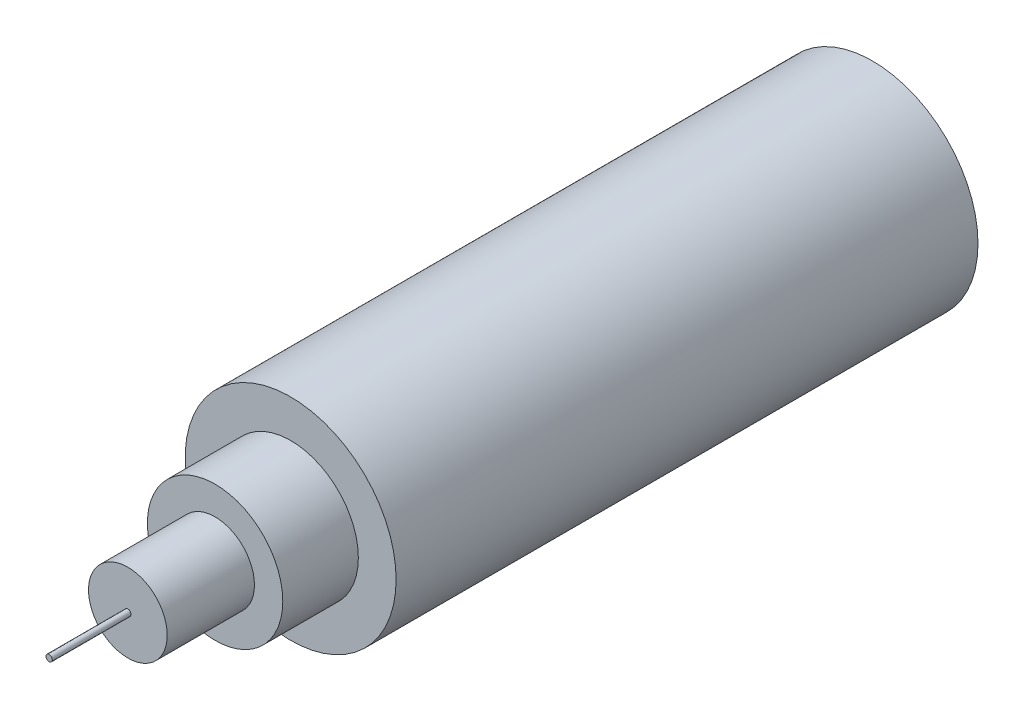
ISO-10303-21;
HEADER;
FILE_DESCRIPTION(('STEP AP214'),'2;1');
FILE_NAME('part.step','',(''),(''),'','','');
FILE_SCHEMA(('AUTOMOTIVE_DESIGN { 1 0 10303 214 1 1 1 1 }'));
ENDSEC;
DATA;
#1=APPLICATION_CONTEXT('core data for automotive mechanical design processes');
#2=APPLICATION_PROTOCOL_DEFINITION('international standard','automotive_design',2000,#1);
#3=PRODUCT_CONTEXT('',#1,'mechanical');
#4=PRODUCT('Part','Part','',(#3));
#5=PRODUCT_RELATED_PRODUCT_CATEGORY('part','',(#4));
#6=PRODUCT_DEFINITION_FORMATION('','',#4);
#7=PRODUCT_DEFINITION_CONTEXT('part definition',#1,'design');
#8=PRODUCT_DEFINITION('design','',#6,#7);
#9=PRODUCT_DEFINITION_SHAPE('','',#8);
#10=(LENGTH_UNIT() NAMED_UNIT(*) SI_UNIT(.MILLI.,.METRE.));
#11=(NAMED_UNIT(*) PLANE_ANGLE_UNIT() SI_UNIT($,.RADIAN.));
#12=(NAMED_UNIT(*) SI_UNIT($,.STERADIAN.) SOLID_ANGLE_UNIT());
#13=UNCERTAINTY_MEASURE_WITH_UNIT(LENGTH_MEASURE(1.E-05),#10,'distance_accuracy_value','');
#14=(GEOMETRIC_REPRESENTATION_CONTEXT(3) GLOBAL_UNCERTAINTY_ASSIGNED_CONTEXT((#13)) GLOBAL_UNIT_ASSIGNED_CONTEXT((#10,
#11,#12)) REPRESENTATION_CONTEXT('',''));
#15=CARTESIAN_POINT('',(0.,0.,0.));
#16=DIRECTION('',(0.,0.,1.));
#17=DIRECTION('',(1.,0.,0.));
#18=AXIS2_PLACEMENT_3D('',#15,#16,#17);
#19=CARTESIAN_POINT('',(0.,0.,236.5));
#20=DIRECTION('',(0.,0.,1.));
#21=DIRECTION('',(1.,0.,0.));
#22=AXIS2_PLACEMENT_3D('',#19,#20,#21);
#23=PLANE('',#22);
#24=CARTESIAN_POINT('',(0.,0.,236.5));
#25=DIRECTION('',(0.,0.,1.));
#26=DIRECTION('',(1.,0.,0.));
#27=AXIS2_PLACEMENT_3D('',#24,#25,#26);
#28=CIRCLE('',#27,12.5);
#29=CARTESIAN_POINT('',(12.5,0.,236.5));
#30=VERTEX_POINT('',#29);
#31=EDGE_CURVE('E47',#30,#30,#28,.T.);
#32=ORIENTED_EDGE('',*,*,#31,.T.);
#33=EDGE_LOOP('',(#32));
#34=FACE_BOUND('',#33,.T.);
#35=CARTESIAN_POINT('',(0.,0.,236.5));
#36=DIRECTION('',(0.,0.,1.));
#37=DIRECTION('',(1.,0.,0.));
#38=AXIS2_PLACEMENT_3D('',#35,#36,#37);
#39=CIRCLE('',#38,1.);
#40=CARTESIAN_POINT('',(1.,0.,236.5));
#41=VERTEX_POINT('',#40);
#42=EDGE_CURVE('E56',#41,#41,#39,.T.);
#43=ORIENTED_EDGE('',*,*,#42,.F.);
#44=EDGE_LOOP('',(#43));
#45=FACE_BOUND('',#44,.T.);
#46=ADVANCED_FACE('F31',(#34,#45),#23,.T.);
#47=CARTESIAN_POINT('',(0.,0.,208.8));
#48=DIRECTION('',(0.,0.,1.));
#49=DIRECTION('',(1.,0.,0.));
#50=AXIS2_PLACEMENT_3D('',#47,#48,#49);
#51=PLANE('',#50);
#52=CARTESIAN_POINT('',(0.,0.,208.8));
#53=DIRECTION('',(0.,0.,1.));
#54=DIRECTION('',(1.,0.,0.));
#55=AXIS2_PLACEMENT_3D('',#52,#53,#54);
#56=CIRCLE('',#55,21.5);
#57=CARTESIAN_POINT('',(21.5,0.,208.8));
#58=VERTEX_POINT('',#57);
#59=EDGE_CURVE('E42',#58,#58,#56,.T.);
#60=ORIENTED_EDGE('',*,*,#59,.T.);
#61=EDGE_LOOP('',(#60));
#62=FACE_BOUND('',#61,.T.);
#63=CARTESIAN_POINT('',(0.,0.,208.8));
#64=DIRECTION('',(0.,0.,1.));
#65=DIRECTION('',(1.,0.,0.));
#66=AXIS2_PLACEMENT_3D('',#63,#64,#65);
#67=CIRCLE('',#66,12.5);
#68=CARTESIAN_POINT('',(12.5,0.,208.8));
#69=VERTEX_POINT('',#68);
#70=EDGE_CURVE('E50',#69,#69,#67,.T.);
#71=ORIENTED_EDGE('',*,*,#70,.F.);
#72=EDGE_LOOP('',(#71));
#73=FACE_BOUND('',#72,.T.);
#74=ADVANCED_FACE('F72',(#62,#73),#51,.T.);
#75=CARTESIAN_POINT('',(0.,0.,184.8));
#76=DIRECTION('',(0.,0.,1.));
#77=DIRECTION('',(1.,0.,0.));
#78=AXIS2_PLACEMENT_3D('',#75,#76,#77);
#79=PLANE('',#78);
#80=CARTESIAN_POINT('',(0.,0.,184.8));
#81=DIRECTION('',(0.,0.,1.));
#82=DIRECTION('',(1.,0.,0.));
#83=AXIS2_PLACEMENT_3D('',#80,#81,#82);
#84=CIRCLE('',#83,33.5);
#85=CARTESIAN_POINT('',(33.5,0.,184.8));
#86=VERTEX_POINT('',#85);
#87=EDGE_CURVE('E10',#86,#86,#84,.T.);
#88=ORIENTED_EDGE('',*,*,#87,.T.);
#89=EDGE_LOOP('',(#88));
#90=FACE_BOUND('',#89,.T.);
#91=CARTESIAN_POINT('',(0.,0.,184.8));
#92=DIRECTION('',(0.,0.,1.));
#93=DIRECTION('',(1.,0.,0.));
#94=AXIS2_PLACEMENT_3D('',#91,#92,#93);
#95=CIRCLE('',#94,21.5);
#96=CARTESIAN_POINT('',(21.5,0.,184.8));
#97=VERTEX_POINT('',#96);
#98=EDGE_CURVE('E44',#97,#97,#95,.T.);
#99=ORIENTED_EDGE('',*,*,#98,.F.);
#100=EDGE_LOOP('',(#99));
#101=FACE_BOUND('',#100,.T.);
#102=ADVANCED_FACE('F78',(#90,#101),#79,.T.);
#103=CARTESIAN_POINT('',(0.,0.,184.8));
#104=DIRECTION('',(0.,0.,-1.));
#105=DIRECTION('',(-1.,0.,0.));
#106=AXIS2_PLACEMENT_3D('',#103,#104,#105);
#107=CYLINDRICAL_SURFACE('',#106,33.5);
#108=ORIENTED_EDGE('',*,*,#87,.F.);
#109=EDGE_LOOP('',(#108));
#110=FACE_BOUND('',#109,.T.);
#111=CARTESIAN_POINT('',(0.,0.,0.));
#112=DIRECTION('',(0.,0.,1.));
#113=DIRECTION('',(1.,0.,0.));
#114=AXIS2_PLACEMENT_3D('',#111,#112,#113);
#115=CIRCLE('',#114,33.5);
#116=CARTESIAN_POINT('',(33.5,0.,0.));
#117=VERTEX_POINT('',#116);
#118=EDGE_CURVE('E35',#117,#117,#115,.T.);
#119=ORIENTED_EDGE('',*,*,#118,.T.);
#120=EDGE_LOOP('',(#119));
#121=FACE_BOUND('',#120,.T.);
#122=ADVANCED_FACE('F33',(#110,#121),#107,.T.);
#123=CARTESIAN_POINT('',(0.,0.,0.));
#124=DIRECTION('',(0.,0.,1.));
#125=DIRECTION('',(1.,0.,0.));
#126=AXIS2_PLACEMENT_3D('',#123,#124,#125);
#127=PLANE('',#126);
#128=ORIENTED_EDGE('',*,*,#118,.F.);
#129=EDGE_LOOP('',(#128));
#130=FACE_BOUND('',#129,.T.);
#131=ADVANCED_FACE('F89',(#130),#127,.F.);
#132=CARTESIAN_POINT('',(0.,0.,208.8));
#133=DIRECTION('',(0.,0.,-1.));
#134=DIRECTION('',(-1.,0.,0.));
#135=AXIS2_PLACEMENT_3D('',#132,#133,#134);
#136=CYLINDRICAL_SURFACE('',#135,21.5);
#137=ORIENTED_EDGE('',*,*,#59,.F.);
#138=EDGE_LOOP('',(#137));
#139=FACE_BOUND('',#138,.T.);
#140=ORIENTED_EDGE('',*,*,#98,.T.);
#141=EDGE_LOOP('',(#140));
#142=FACE_BOUND('',#141,.T.);
#143=ADVANCED_FACE('F84',(#139,#142),#136,.T.);
#144=CARTESIAN_POINT('',(0.,0.,236.5));
#145=DIRECTION('',(0.,0.,-1.));
#146=DIRECTION('',(-1.,0.,0.));
#147=AXIS2_PLACEMENT_3D('',#144,#145,#146);
#148=CYLINDRICAL_SURFACE('',#147,12.5);
#149=ORIENTED_EDGE('',*,*,#31,.F.);
#150=EDGE_LOOP('',(#149));
#151=FACE_BOUND('',#150,.T.);
#152=ORIENTED_EDGE('',*,*,#70,.T.);
#153=EDGE_LOOP('',(#152));
#154=FACE_BOUND('',#153,.T.);
#155=ADVANCED_FACE('F67',(#151,#154),#148,.T.);
#156=CARTESIAN_POINT('',(0.,0.,261.5));
#157=DIRECTION('',(0.,0.,-1.));
#158=DIRECTION('',(-1.,0.,0.));
#159=AXIS2_PLACEMENT_3D('',#156,#157,#158);
#160=CYLINDRICAL_SURFACE('',#159,1.);
#161=CARTESIAN_POINT('',(0.,0.,261.5));
#162=DIRECTION('',(0.,0.,1.));
#163=DIRECTION('',(1.,0.,0.));
#164=AXIS2_PLACEMENT_3D('',#161,#162,#163);
#165=CIRCLE('',#164,1.);
#166=CARTESIAN_POINT('',(1.,0.,261.5));
#167=VERTEX_POINT('',#166);
#168=EDGE_CURVE('E53',#167,#167,#165,.T.);
#169=ORIENTED_EDGE('',*,*,#168,.F.);
#170=EDGE_LOOP('',(#169));
#171=FACE_BOUND('',#170,.T.);
#172=ORIENTED_EDGE('',*,*,#42,.T.);
#173=EDGE_LOOP('',(#172));
#174=FACE_BOUND('',#173,.T.);
#175=ADVANCED_FACE('F64',(#171,#174),#160,.T.);
#176=CARTESIAN_POINT('',(0.,0.,261.5));
#177=DIRECTION('',(0.,0.,1.));
#178=DIRECTION('',(1.,0.,0.));
#179=AXIS2_PLACEMENT_3D('',#176,#177,#178);
#180=PLANE('',#179);
#181=ORIENTED_EDGE('',*,*,#168,.T.);
#182=EDGE_LOOP('',(#181));
#183=FACE_BOUND('',#182,.T.);
#184=ADVANCED_FACE('F62',(#183),#180,.T.);
#185=CLOSED_SHELL('',(#46,#74,#102,#122,#131,#143,#155,#175,#184));
#186=MANIFOLD_SOLID_BREP('B2',#185);
#187=ADVANCED_BREP_SHAPE_REPRESENTATION('',(#18,#186),#14);
#188=SHAPE_DEFINITION_REPRESENTATION(#9,#187);
ENDSEC;
END-ISO-10303-21;
